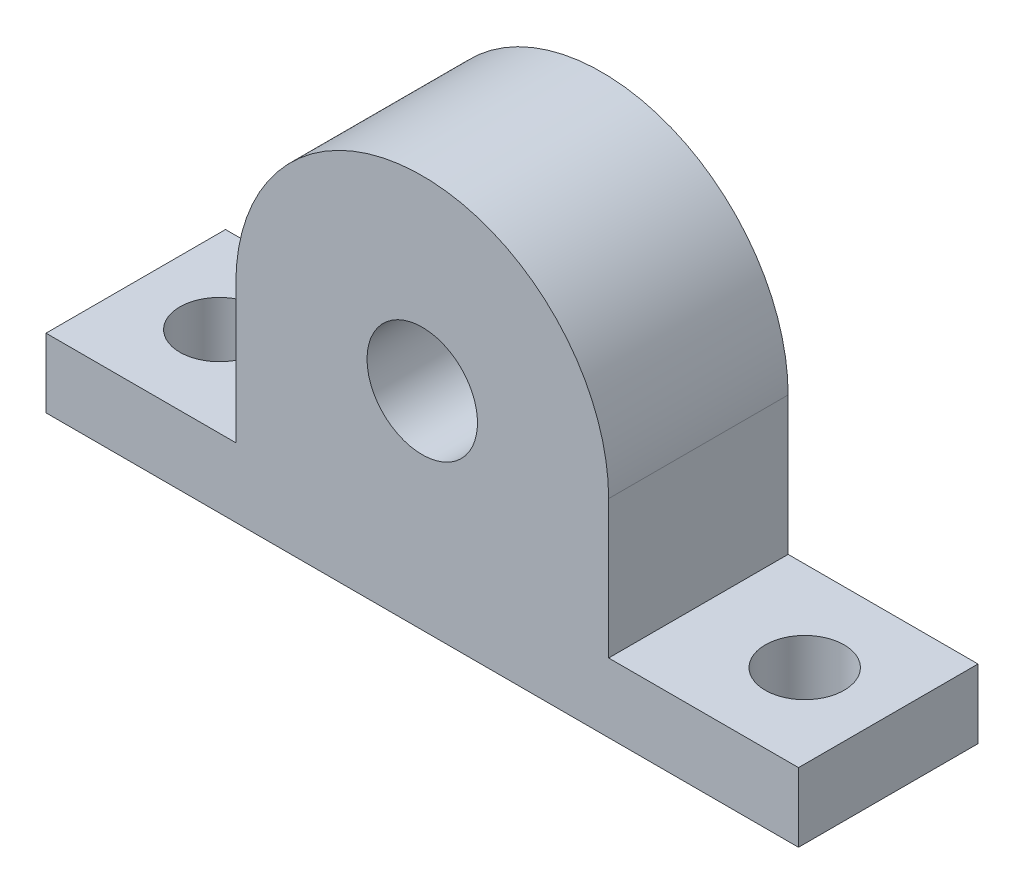
ISO-10303-21;
HEADER;
FILE_DESCRIPTION(('STEP AP214'),'2;1');
FILE_NAME('part.step','',(''),(''),'','','');
FILE_SCHEMA(('AUTOMOTIVE_DESIGN { 1 0 10303 214 1 1 1 1 }'));
ENDSEC;
DATA;
#1=APPLICATION_CONTEXT('core data for automotive mechanical design processes');
#2=APPLICATION_PROTOCOL_DEFINITION('international standard','automotive_design',2000,#1);
#3=PRODUCT_CONTEXT('',#1,'mechanical');
#4=PRODUCT('Part','Part','',(#3));
#5=PRODUCT_RELATED_PRODUCT_CATEGORY('part','',(#4));
#6=PRODUCT_DEFINITION_FORMATION('','',#4);
#7=PRODUCT_DEFINITION_CONTEXT('part definition',#1,'design');
#8=PRODUCT_DEFINITION('design','',#6,#7);
#9=PRODUCT_DEFINITION_SHAPE('','',#8);
#10=(LENGTH_UNIT() NAMED_UNIT(*) SI_UNIT(.MILLI.,.METRE.));
#11=(NAMED_UNIT(*) PLANE_ANGLE_UNIT() SI_UNIT($,.RADIAN.));
#12=(NAMED_UNIT(*) SI_UNIT($,.STERADIAN.) SOLID_ANGLE_UNIT());
#13=UNCERTAINTY_MEASURE_WITH_UNIT(LENGTH_MEASURE(1.E-05),#10,'distance_accuracy_value','');
#14=(GEOMETRIC_REPRESENTATION_CONTEXT(3) GLOBAL_UNCERTAINTY_ASSIGNED_CONTEXT((#13)) GLOBAL_UNIT_ASSIGNED_CONTEXT((#10,
#11,#12)) REPRESENTATION_CONTEXT('',''));
#15=CARTESIAN_POINT('',(0.,0.,0.));
#16=DIRECTION('',(0.,0.,1.));
#17=DIRECTION('',(1.,0.,0.));
#18=AXIS2_PLACEMENT_3D('',#15,#16,#17);
#19=CARTESIAN_POINT('',(27.25,15.,13.));
#20=DIRECTION('',(0.,0.,1.));
#21=DIRECTION('',(1.,0.,0.));
#22=AXIS2_PLACEMENT_3D('',#19,#20,#21);
#23=PLANE('',#22);
#24=DIRECTION('',(0.,-1.,0.));
#25=VECTOR('',#24,1.);
#26=CARTESIAN_POINT('',(0.,0.,13.));
#27=LINE('',#26,#25);
#28=CARTESIAN_POINT('',(0.,5.,13.));
#29=VERTEX_POINT('',#28);
#30=CARTESIAN_POINT('',(0.,0.,13.));
#31=VERTEX_POINT('',#30);
#32=EDGE_CURVE('E144',#29,#31,#27,.T.);
#33=ORIENTED_EDGE('',*,*,#32,.T.);
#34=DIRECTION('',(1.,0.,0.));
#35=VECTOR('',#34,1.);
#36=CARTESIAN_POINT('',(0.,0.,13.));
#37=LINE('',#36,#35);
#38=CARTESIAN_POINT('',(54.5,0.,13.));
#39=VERTEX_POINT('',#38);
#40=EDGE_CURVE('E92',#31,#39,#37,.T.);
#41=ORIENTED_EDGE('',*,*,#40,.T.);
#42=DIRECTION('',(0.,1.,0.));
#43=VECTOR('',#42,1.);
#44=CARTESIAN_POINT('',(54.5,0.,13.));
#45=LINE('',#44,#43);
#46=CARTESIAN_POINT('',(54.5,5.,13.));
#47=VERTEX_POINT('',#46);
#48=EDGE_CURVE('E159',#39,#47,#45,.T.);
#49=ORIENTED_EDGE('',*,*,#48,.T.);
#50=DIRECTION('',(-1.,0.,0.));
#51=VECTOR('',#50,1.);
#52=CARTESIAN_POINT('',(40.75,5.,13.));
#53=LINE('',#52,#51);
#54=CARTESIAN_POINT('',(40.75,5.,13.));
#55=VERTEX_POINT('',#54);
#56=EDGE_CURVE('E172',#47,#55,#53,.T.);
#57=ORIENTED_EDGE('',*,*,#56,.T.);
#58=DIRECTION('',(0.,1.,0.));
#59=VECTOR('',#58,1.);
#60=CARTESIAN_POINT('',(40.75,15.,13.));
#61=LINE('',#60,#59);
#62=CARTESIAN_POINT('',(40.75,15.,13.));
#63=VERTEX_POINT('',#62);
#64=EDGE_CURVE('E111',#55,#63,#61,.T.);
#65=ORIENTED_EDGE('',*,*,#64,.T.);
#66=CARTESIAN_POINT('',(27.25,15.,13.));
#67=DIRECTION('',(0.,0.,1.));
#68=DIRECTION('',(1.,0.,0.));
#69=AXIS2_PLACEMENT_3D('',#66,#67,#68);
#70=CIRCLE('',#69,13.5);
#71=CARTESIAN_POINT('',(13.75,15.,13.));
#72=VERTEX_POINT('',#71);
#73=EDGE_CURVE('E105',#63,#72,#70,.T.);
#74=ORIENTED_EDGE('',*,*,#73,.T.);
#75=DIRECTION('',(0.,-1.,0.));
#76=VECTOR('',#75,1.);
#77=CARTESIAN_POINT('',(13.75,15.,13.));
#78=LINE('',#77,#76);
#79=CARTESIAN_POINT('',(13.75,5.,13.));
#80=VERTEX_POINT('',#79);
#81=EDGE_CURVE('E109',#72,#80,#78,.T.);
#82=ORIENTED_EDGE('',*,*,#81,.T.);
#83=DIRECTION('',(-1.,0.,0.));
#84=VECTOR('',#83,1.);
#85=CARTESIAN_POINT('',(0.,5.,13.));
#86=LINE('',#85,#84);
#87=EDGE_CURVE('E49',#80,#29,#86,.T.);
#88=ORIENTED_EDGE('',*,*,#87,.T.);
#89=EDGE_LOOP('',(#33,#41,#49,#57,#65,#74,#82,#88));
#90=FACE_BOUND('',#89,.T.);
#91=CARTESIAN_POINT('',(27.25,15.,13.));
#92=DIRECTION('',(0.,0.,1.));
#93=DIRECTION('',(1.,0.,0.));
#94=AXIS2_PLACEMENT_3D('',#91,#92,#93);
#95=CIRCLE('',#94,4.);
#96=CARTESIAN_POINT('',(23.25,15.,13.));
#97=VERTEX_POINT('',#96);
#98=EDGE_CURVE('E133',#97,#97,#95,.T.);
#99=ORIENTED_EDGE('',*,*,#98,.F.);
#100=EDGE_LOOP('',(#99));
#101=FACE_BOUND('',#100,.T.);
#102=ADVANCED_FACE('F32',(#90,#101),#23,.T.);
#103=CARTESIAN_POINT('',(27.25,15.,0.));
#104=DIRECTION('',(0.,0.,1.));
#105=DIRECTION('',(1.,0.,0.));
#106=AXIS2_PLACEMENT_3D('',#103,#104,#105);
#107=PLANE('',#106);
#108=DIRECTION('',(0.,-1.,0.));
#109=VECTOR('',#108,1.);
#110=CARTESIAN_POINT('',(0.,0.,0.));
#111=LINE('',#110,#109);
#112=CARTESIAN_POINT('',(0.,5.,0.));
#113=VERTEX_POINT('',#112);
#114=CARTESIAN_POINT('',(0.,0.,0.));
#115=VERTEX_POINT('',#114);
#116=EDGE_CURVE('E129',#113,#115,#111,.T.);
#117=ORIENTED_EDGE('',*,*,#116,.F.);
#118=DIRECTION('',(-1.,0.,0.));
#119=VECTOR('',#118,1.);
#120=CARTESIAN_POINT('',(0.,5.,0.));
#121=LINE('',#120,#119);
#122=CARTESIAN_POINT('',(13.75,5.,0.));
#123=VERTEX_POINT('',#122);
#124=EDGE_CURVE('E84',#123,#113,#121,.T.);
#125=ORIENTED_EDGE('',*,*,#124,.F.);
#126=DIRECTION('',(0.,-1.,0.));
#127=VECTOR('',#126,1.);
#128=CARTESIAN_POINT('',(13.75,15.,0.));
#129=LINE('',#128,#127);
#130=CARTESIAN_POINT('',(13.75,15.,0.));
#131=VERTEX_POINT('',#130);
#132=EDGE_CURVE('E78',#131,#123,#129,.T.);
#133=ORIENTED_EDGE('',*,*,#132,.F.);
#134=CARTESIAN_POINT('',(27.25,15.,0.));
#135=DIRECTION('',(0.,0.,1.));
#136=DIRECTION('',(1.,0.,0.));
#137=AXIS2_PLACEMENT_3D('',#134,#135,#136);
#138=CIRCLE('',#137,13.5);
#139=CARTESIAN_POINT('',(40.75,15.,0.));
#140=VERTEX_POINT('',#139);
#141=EDGE_CURVE('E119',#140,#131,#138,.T.);
#142=ORIENTED_EDGE('',*,*,#141,.F.);
#143=DIRECTION('',(0.,1.,0.));
#144=VECTOR('',#143,1.);
#145=CARTESIAN_POINT('',(40.75,15.,0.));
#146=LINE('',#145,#144);
#147=CARTESIAN_POINT('',(40.75,5.,0.));
#148=VERTEX_POINT('',#147);
#149=EDGE_CURVE('E139',#148,#140,#146,.T.);
#150=ORIENTED_EDGE('',*,*,#149,.F.);
#151=DIRECTION('',(-1.,0.,0.));
#152=VECTOR('',#151,1.);
#153=CARTESIAN_POINT('',(40.75,5.,0.));
#154=LINE('',#153,#152);
#155=CARTESIAN_POINT('',(54.5,5.,0.));
#156=VERTEX_POINT('',#155);
#157=EDGE_CURVE('E137',#156,#148,#154,.T.);
#158=ORIENTED_EDGE('',*,*,#157,.F.);
#159=DIRECTION('',(0.,1.,0.));
#160=VECTOR('',#159,1.);
#161=CARTESIAN_POINT('',(54.5,0.,0.));
#162=LINE('',#161,#160);
#163=CARTESIAN_POINT('',(54.5,0.,0.));
#164=VERTEX_POINT('',#163);
#165=EDGE_CURVE('E135',#164,#156,#162,.T.);
#166=ORIENTED_EDGE('',*,*,#165,.F.);
#167=DIRECTION('',(1.,0.,0.));
#168=VECTOR('',#167,1.);
#169=CARTESIAN_POINT('',(0.,0.,0.));
#170=LINE('',#169,#168);
#171=EDGE_CURVE('E132',#115,#164,#170,.T.);
#172=ORIENTED_EDGE('',*,*,#171,.F.);
#173=EDGE_LOOP('',(#117,#125,#133,#142,#150,#158,#166,#172));
#174=FACE_BOUND('',#173,.T.);
#175=CARTESIAN_POINT('',(27.25,15.,0.));
#176=DIRECTION('',(0.,0.,1.));
#177=DIRECTION('',(1.,0.,0.));
#178=AXIS2_PLACEMENT_3D('',#175,#176,#177);
#179=CIRCLE('',#178,4.);
#180=CARTESIAN_POINT('',(23.25,15.,0.));
#181=VERTEX_POINT('',#180);
#182=EDGE_CURVE('E178',#181,#181,#179,.T.);
#183=ORIENTED_EDGE('',*,*,#182,.T.);
#184=EDGE_LOOP('',(#183));
#185=FACE_BOUND('',#184,.T.);
#186=ADVANCED_FACE('F163',(#174,#185),#107,.F.);
#187=CARTESIAN_POINT('',(0.,0.,13.));
#188=DIRECTION('',(1.,0.,0.));
#189=DIRECTION('',(0.,0.,-1.));
#190=AXIS2_PLACEMENT_3D('',#187,#188,#189);
#191=PLANE('',#190);
#192=ORIENTED_EDGE('',*,*,#116,.T.);
#193=DIRECTION('',(0.,0.,-1.));
#194=VECTOR('',#193,1.);
#195=CARTESIAN_POINT('',(0.,0.,13.));
#196=LINE('',#195,#194);
#197=EDGE_CURVE('E11',#31,#115,#196,.T.);
#198=ORIENTED_EDGE('',*,*,#197,.F.);
#199=ORIENTED_EDGE('',*,*,#32,.F.);
#200=DIRECTION('',(0.,0.,-1.));
#201=VECTOR('',#200,1.);
#202=CARTESIAN_POINT('',(0.,5.,13.));
#203=LINE('',#202,#201);
#204=EDGE_CURVE('E125',#29,#113,#203,.T.);
#205=ORIENTED_EDGE('',*,*,#204,.T.);
#206=EDGE_LOOP('',(#192,#198,#199,#205));
#207=FACE_BOUND('',#206,.T.);
#208=ADVANCED_FACE('F34',(#207),#191,.F.);
#209=CARTESIAN_POINT('',(0.,0.,13.));
#210=DIRECTION('',(0.,1.,0.));
#211=DIRECTION('',(0.,0.,1.));
#212=AXIS2_PLACEMENT_3D('',#209,#210,#211);
#213=PLANE('',#212);
#214=CARTESIAN_POINT('',(6.05,0.,6.49999999999999));
#215=DIRECTION('',(0.,1.,0.));
#216=DIRECTION('',(0.,0.,1.));
#217=AXIS2_PLACEMENT_3D('',#214,#215,#216);
#218=CIRCLE('',#217,2.85374590165543);
#219=CARTESIAN_POINT('',(3.19625409834457,0.,6.49999999999999));
#220=VERTEX_POINT('',#219);
#221=EDGE_CURVE('E189',#220,#220,#218,.T.);
#222=ORIENTED_EDGE('',*,*,#221,.T.);
#223=EDGE_LOOP('',(#222));
#224=FACE_BOUND('',#223,.T.);
#225=CARTESIAN_POINT('',(48.45,0.,6.5));
#226=DIRECTION('',(0.,1.,0.));
#227=DIRECTION('',(0.,0.,1.));
#228=AXIS2_PLACEMENT_3D('',#225,#226,#227);
#229=CIRCLE('',#228,2.85374590165543);
#230=CARTESIAN_POINT('',(45.5962540983446,0.,6.5));
#231=VERTEX_POINT('',#230);
#232=EDGE_CURVE('E181',#231,#231,#229,.T.);
#233=ORIENTED_EDGE('',*,*,#232,.T.);
#234=EDGE_LOOP('',(#233));
#235=FACE_BOUND('',#234,.T.);
#236=ORIENTED_EDGE('',*,*,#171,.T.);
#237=DIRECTION('',(0.,0.,-1.));
#238=VECTOR('',#237,1.);
#239=CARTESIAN_POINT('',(54.5,0.,13.));
#240=LINE('',#239,#238);
#241=EDGE_CURVE('E41',#39,#164,#240,.T.);
#242=ORIENTED_EDGE('',*,*,#241,.F.);
#243=ORIENTED_EDGE('',*,*,#40,.F.);
#244=ORIENTED_EDGE('',*,*,#197,.T.);
#245=EDGE_LOOP('',(#236,#242,#243,#244));
#246=FACE_BOUND('',#245,.T.);
#247=ADVANCED_FACE('F242',(#224,#235,#246),#213,.F.);
#248=CARTESIAN_POINT('',(54.5,0.,13.));
#249=DIRECTION('',(-1.,0.,0.));
#250=DIRECTION('',(0.,0.,1.));
#251=AXIS2_PLACEMENT_3D('',#248,#249,#250);
#252=PLANE('',#251);
#253=ORIENTED_EDGE('',*,*,#165,.T.);
#254=DIRECTION('',(0.,0.,-1.));
#255=VECTOR('',#254,1.);
#256=CARTESIAN_POINT('',(54.5,5.,13.));
#257=LINE('',#256,#255);
#258=EDGE_CURVE('E151',#47,#156,#257,.T.);
#259=ORIENTED_EDGE('',*,*,#258,.F.);
#260=ORIENTED_EDGE('',*,*,#48,.F.);
#261=ORIENTED_EDGE('',*,*,#241,.T.);
#262=EDGE_LOOP('',(#253,#259,#260,#261));
#263=FACE_BOUND('',#262,.T.);
#264=ADVANCED_FACE('F157',(#263),#252,.F.);
#265=CARTESIAN_POINT('',(40.75,5.,13.));
#266=DIRECTION('',(0.,-1.,0.));
#267=DIRECTION('',(1.,0.,0.));
#268=AXIS2_PLACEMENT_3D('',#265,#266,#267);
#269=PLANE('',#268);
#270=CARTESIAN_POINT('',(48.45,5.,6.5));
#271=DIRECTION('',(0.,1.,0.));
#272=DIRECTION('',(-1.,0.,0.));
#273=AXIS2_PLACEMENT_3D('',#270,#271,#272);
#274=CIRCLE('',#273,2.85374590165543);
#275=CARTESIAN_POINT('',(45.5962540983446,5.,6.5));
#276=VERTEX_POINT('',#275);
#277=EDGE_CURVE('E186',#276,#276,#274,.T.);
#278=ORIENTED_EDGE('',*,*,#277,.F.);
#279=EDGE_LOOP('',(#278));
#280=FACE_BOUND('',#279,.T.);
#281=ORIENTED_EDGE('',*,*,#157,.T.);
#282=DIRECTION('',(0.,0.,-1.));
#283=VECTOR('',#282,1.);
#284=CARTESIAN_POINT('',(40.75,5.,13.));
#285=LINE('',#284,#283);
#286=EDGE_CURVE('E148',#55,#148,#285,.T.);
#287=ORIENTED_EDGE('',*,*,#286,.F.);
#288=ORIENTED_EDGE('',*,*,#56,.F.);
#289=ORIENTED_EDGE('',*,*,#258,.T.);
#290=EDGE_LOOP('',(#281,#287,#288,#289));
#291=FACE_BOUND('',#290,.T.);
#292=ADVANCED_FACE('F168',(#280,#291),#269,.F.);
#293=CARTESIAN_POINT('',(40.75,15.,13.));
#294=DIRECTION('',(-1.,0.,0.));
#295=DIRECTION('',(0.,0.,1.));
#296=AXIS2_PLACEMENT_3D('',#293,#294,#295);
#297=PLANE('',#296);
#298=ORIENTED_EDGE('',*,*,#149,.T.);
#299=DIRECTION('',(0.,0.,-1.));
#300=VECTOR('',#299,1.);
#301=CARTESIAN_POINT('',(40.75,15.,13.));
#302=LINE('',#301,#300);
#303=EDGE_CURVE('E120',#63,#140,#302,.T.);
#304=ORIENTED_EDGE('',*,*,#303,.F.);
#305=ORIENTED_EDGE('',*,*,#64,.F.);
#306=ORIENTED_EDGE('',*,*,#286,.T.);
#307=EDGE_LOOP('',(#298,#304,#305,#306));
#308=FACE_BOUND('',#307,.T.);
#309=ADVANCED_FACE('F171',(#308),#297,.F.);
#310=CARTESIAN_POINT('',(27.25,15.,13.));
#311=DIRECTION('',(0.,0.,-1.));
#312=DIRECTION('',(-1.,0.,0.));
#313=AXIS2_PLACEMENT_3D('',#310,#311,#312);
#314=CYLINDRICAL_SURFACE('',#313,13.5);
#315=ORIENTED_EDGE('',*,*,#141,.T.);
#316=DIRECTION('',(0.,0.,-1.));
#317=VECTOR('',#316,1.);
#318=CARTESIAN_POINT('',(13.75,15.,13.));
#319=LINE('',#318,#317);
#320=EDGE_CURVE('E116',#72,#131,#319,.T.);
#321=ORIENTED_EDGE('',*,*,#320,.F.);
#322=ORIENTED_EDGE('',*,*,#73,.F.);
#323=ORIENTED_EDGE('',*,*,#303,.T.);
#324=EDGE_LOOP('',(#315,#321,#322,#323));
#325=FACE_BOUND('',#324,.T.);
#326=ADVANCED_FACE('F117',(#325),#314,.T.);
#327=CARTESIAN_POINT('',(13.75,15.,13.));
#328=DIRECTION('',(1.,0.,0.));
#329=DIRECTION('',(0.,0.,-1.));
#330=AXIS2_PLACEMENT_3D('',#327,#328,#329);
#331=PLANE('',#330);
#332=ORIENTED_EDGE('',*,*,#132,.T.);
#333=DIRECTION('',(0.,0.,-1.));
#334=VECTOR('',#333,1.);
#335=CARTESIAN_POINT('',(13.75,5.,13.));
#336=LINE('',#335,#334);
#337=EDGE_CURVE('E121',#80,#123,#336,.T.);
#338=ORIENTED_EDGE('',*,*,#337,.F.);
#339=ORIENTED_EDGE('',*,*,#81,.F.);
#340=ORIENTED_EDGE('',*,*,#320,.T.);
#341=EDGE_LOOP('',(#332,#338,#339,#340));
#342=FACE_BOUND('',#341,.T.);
#343=ADVANCED_FACE('F123',(#342),#331,.F.);
#344=CARTESIAN_POINT('',(0.,5.,13.));
#345=DIRECTION('',(0.,-1.,0.));
#346=DIRECTION('',(1.,0.,0.));
#347=AXIS2_PLACEMENT_3D('',#344,#345,#346);
#348=PLANE('',#347);
#349=CARTESIAN_POINT('',(6.05,5.,6.49999999999999));
#350=DIRECTION('',(0.,1.,0.));
#351=DIRECTION('',(1.,0.,0.));
#352=AXIS2_PLACEMENT_3D('',#349,#350,#351);
#353=CIRCLE('',#352,2.85374590165543);
#354=CARTESIAN_POINT('',(3.19625409834457,5.,6.49999999999999));
#355=VERTEX_POINT('',#354);
#356=EDGE_CURVE('E192',#355,#355,#353,.T.);
#357=ORIENTED_EDGE('',*,*,#356,.F.);
#358=EDGE_LOOP('',(#357));
#359=FACE_BOUND('',#358,.T.);
#360=ORIENTED_EDGE('',*,*,#124,.T.);
#361=ORIENTED_EDGE('',*,*,#204,.F.);
#362=ORIENTED_EDGE('',*,*,#87,.F.);
#363=ORIENTED_EDGE('',*,*,#337,.T.);
#364=EDGE_LOOP('',(#360,#361,#362,#363));
#365=FACE_BOUND('',#364,.T.);
#366=ADVANCED_FACE('F199',(#359,#365),#348,.F.);
#367=CARTESIAN_POINT('',(27.25,15.,13.));
#368=DIRECTION('',(0.,0.,-1.));
#369=DIRECTION('',(-1.,0.,0.));
#370=AXIS2_PLACEMENT_3D('',#367,#368,#369);
#371=CYLINDRICAL_SURFACE('',#370,4.);
#372=CARTESIAN_POINT('',(23.25,15.,13.));
#373=CARTESIAN_POINT('',(23.25,15.,12.8645833333333));
#374=CARTESIAN_POINT('',(23.25,15.,12.7291666666667));
#375=CARTESIAN_POINT('',(23.25,15.,12.4583333333333));
#376=CARTESIAN_POINT('',(23.25,15.,12.3229166666667));
#377=CARTESIAN_POINT('',(23.25,15.,12.0520833333333));
#378=CARTESIAN_POINT('',(23.25,15.,11.9166666666667));
#379=CARTESIAN_POINT('',(23.25,15.,11.6458333333333));
#380=CARTESIAN_POINT('',(23.25,15.,11.5104166666667));
#381=CARTESIAN_POINT('',(23.25,15.,11.2395833333333));
#382=CARTESIAN_POINT('',(23.25,15.,11.1041666666667));
#383=CARTESIAN_POINT('',(23.25,15.,10.8333333333333));
#384=CARTESIAN_POINT('',(23.25,15.,10.6979166666667));
#385=CARTESIAN_POINT('',(23.25,15.,10.4270833333333));
#386=CARTESIAN_POINT('',(23.25,15.,10.2916666666667));
#387=CARTESIAN_POINT('',(23.25,15.,10.0208333333333));
#388=CARTESIAN_POINT('',(23.25,15.,9.88541666666667));
#389=CARTESIAN_POINT('',(23.25,15.,9.61458333333333));
#390=CARTESIAN_POINT('',(23.25,15.,9.47916666666667));
#391=CARTESIAN_POINT('',(23.25,15.,9.20833333333333));
#392=CARTESIAN_POINT('',(23.25,15.,9.07291666666667));
#393=CARTESIAN_POINT('',(23.25,15.,8.80208333333333));
#394=CARTESIAN_POINT('',(23.25,15.,8.66666666666667));
#395=CARTESIAN_POINT('',(23.25,15.,8.39583333333333));
#396=CARTESIAN_POINT('',(23.25,15.,8.26041666666667));
#397=CARTESIAN_POINT('',(23.25,15.,7.98958333333333));
#398=CARTESIAN_POINT('',(23.25,15.,7.85416666666667));
#399=CARTESIAN_POINT('',(23.25,15.,7.58333333333333));
#400=CARTESIAN_POINT('',(23.25,15.,7.44791666666667));
#401=CARTESIAN_POINT('',(23.25,15.,7.17708333333333));
#402=CARTESIAN_POINT('',(23.25,15.,7.04166666666667));
#403=CARTESIAN_POINT('',(23.25,15.,6.77083333333333));
#404=CARTESIAN_POINT('',(23.25,15.,6.63541666666667));
#405=CARTESIAN_POINT('',(23.25,15.,6.36458333333333));
#406=CARTESIAN_POINT('',(23.25,15.,6.22916666666667));
#407=CARTESIAN_POINT('',(23.25,15.,5.95833333333333));
#408=CARTESIAN_POINT('',(23.25,15.,5.82291666666667));
#409=CARTESIAN_POINT('',(23.25,15.,5.55208333333333));
#410=CARTESIAN_POINT('',(23.25,15.,5.41666666666667));
#411=CARTESIAN_POINT('',(23.25,15.,5.14583333333333));
#412=CARTESIAN_POINT('',(23.25,15.,5.01041666666667));
#413=CARTESIAN_POINT('',(23.25,15.,4.73958333333333));
#414=CARTESIAN_POINT('',(23.25,15.,4.60416666666667));
#415=CARTESIAN_POINT('',(23.25,15.,4.33333333333333));
#416=CARTESIAN_POINT('',(23.25,15.,4.19791666666667));
#417=CARTESIAN_POINT('',(23.25,15.,3.92708333333333));
#418=CARTESIAN_POINT('',(23.25,15.,3.79166666666667));
#419=CARTESIAN_POINT('',(23.25,15.,3.52083333333333));
#420=CARTESIAN_POINT('',(23.25,15.,3.38541666666667));
#421=CARTESIAN_POINT('',(23.25,15.,3.11458333333333));
#422=CARTESIAN_POINT('',(23.25,15.,2.97916666666667));
#423=CARTESIAN_POINT('',(23.25,15.,2.70833333333333));
#424=CARTESIAN_POINT('',(23.25,15.,2.57291666666667));
#425=CARTESIAN_POINT('',(23.25,15.,2.30208333333333));
#426=CARTESIAN_POINT('',(23.25,15.,2.16666666666667));
#427=CARTESIAN_POINT('',(23.25,15.,1.89583333333333));
#428=CARTESIAN_POINT('',(23.25,15.,1.76041666666667));
#429=CARTESIAN_POINT('',(23.25,15.,1.48958333333333));
#430=CARTESIAN_POINT('',(23.25,15.,1.35416666666667));
#431=CARTESIAN_POINT('',(23.25,15.,1.08333333333333));
#432=CARTESIAN_POINT('',(23.25,15.,0.947916666666667));
#433=CARTESIAN_POINT('',(23.25,15.,0.677083333333334));
#434=CARTESIAN_POINT('',(23.25,15.,0.541666666666667));
#435=CARTESIAN_POINT('',(23.25,15.,0.270833333333334));
#436=CARTESIAN_POINT('',(23.25,15.,0.135416666666667));
#437=CARTESIAN_POINT('',(23.25,15.,0.));
#438=B_SPLINE_CURVE_WITH_KNOTS('',3,(#372,#373,#374,#375,#376,#377,#378,#379,#380,#381,#382,
#383,#384,#385,#386,#387,#388,#389,#390,#391,#392,#393,#394,#395,#396,#397,#398,#399,#400,#401,
#402,#403,#404,#405,#406,#407,#408,#409,#410,#411,#412,#413,#414,#415,#416,#417,#418,#419,#420,
#421,#422,#423,#424,#425,#426,#427,#428,#429,#430,#431,#432,#433,#434,#435,#436,#437),
.UNSPECIFIED.,.F.,.F.,(4,2,2,2,2,2,2,2,2,2,2,2,2,2,2,2,2,2,2,2,2,2,2,2,2,2,2,2,2,2,2,2,4),(0.,
0.406249999999999,0.812499999999999,1.21875,1.625,2.03125,2.4375,2.84375,3.25,3.65625,4.0625,
4.46875,4.875,5.28125,5.6875,6.09375,6.5,6.90625,7.3125,7.71875,8.125,8.53125,8.9375,9.34375,
9.75,10.15625,10.5625,10.96875,11.375,11.78125,12.1875,12.59375,13.),.UNSPECIFIED.);
#439=EDGE_CURVE('BSEAM201',#97,#181,#438,.T.);
#440=ORIENTED_EDGE('',*,*,#98,.T.);
#441=ORIENTED_EDGE('',*,*,#182,.F.);
#442=ORIENTED_EDGE('',*,*,#439,.T.);
#443=ORIENTED_EDGE('',*,*,#439,.F.);
#444=EDGE_LOOP('',(#440,#442,#441,#443));
#445=FACE_BOUND('',#444,.T.);
#446=ADVANCED_FACE('F201',(#445),#371,.F.);
#447=CARTESIAN_POINT('',(48.45,-8.,6.5));
#448=DIRECTION('',(0.,1.,0.));
#449=DIRECTION('',(-1.,0.,0.));
#450=AXIS2_PLACEMENT_3D('',#447,#448,#449);
#451=CYLINDRICAL_SURFACE('',#450,2.85374590165543);
#452=CARTESIAN_POINT('',(45.5962540983446,5.,6.5));
#453=CARTESIAN_POINT('',(45.5962540983446,4.94791666666667,6.5));
#454=CARTESIAN_POINT('',(45.5962540983446,4.89583333333334,6.5));
#455=CARTESIAN_POINT('',(45.5962540983446,4.79166666666667,6.5));
#456=CARTESIAN_POINT('',(45.5962540983446,4.73958333333334,6.5));
#457=CARTESIAN_POINT('',(45.5962540983446,4.63541666666667,6.5));
#458=CARTESIAN_POINT('',(45.5962540983446,4.58333333333334,6.5));
#459=CARTESIAN_POINT('',(45.5962540983446,4.47916666666667,6.5));
#460=CARTESIAN_POINT('',(45.5962540983446,4.42708333333334,6.5));
#461=CARTESIAN_POINT('',(45.5962540983446,4.32291666666667,6.5));
#462=CARTESIAN_POINT('',(45.5962540983446,4.27083333333334,6.5));
#463=CARTESIAN_POINT('',(45.5962540983446,4.16666666666667,6.5));
#464=CARTESIAN_POINT('',(45.5962540983446,4.11458333333334,6.5));
#465=CARTESIAN_POINT('',(45.5962540983446,4.01041666666667,6.5));
#466=CARTESIAN_POINT('',(45.5962540983446,3.95833333333334,6.5));
#467=CARTESIAN_POINT('',(45.5962540983446,3.85416666666667,6.5));
#468=CARTESIAN_POINT('',(45.5962540983446,3.80208333333333,6.5));
#469=CARTESIAN_POINT('',(45.5962540983446,3.69791666666667,6.5));
#470=CARTESIAN_POINT('',(45.5962540983446,3.64583333333333,6.5));
#471=CARTESIAN_POINT('',(45.5962540983446,3.54166666666667,6.5));
#472=CARTESIAN_POINT('',(45.5962540983446,3.48958333333333,6.5));
#473=CARTESIAN_POINT('',(45.5962540983446,3.38541666666667,6.5));
#474=CARTESIAN_POINT('',(45.5962540983446,3.33333333333333,6.5));
#475=CARTESIAN_POINT('',(45.5962540983446,3.22916666666667,6.5));
#476=CARTESIAN_POINT('',(45.5962540983446,3.17708333333333,6.5));
#477=CARTESIAN_POINT('',(45.5962540983446,3.07291666666667,6.5));
#478=CARTESIAN_POINT('',(45.5962540983446,3.02083333333333,6.5));
#479=CARTESIAN_POINT('',(45.5962540983446,2.91666666666667,6.5));
#480=CARTESIAN_POINT('',(45.5962540983446,2.86458333333333,6.5));
#481=CARTESIAN_POINT('',(45.5962540983446,2.76041666666667,6.5));
#482=CARTESIAN_POINT('',(45.5962540983446,2.70833333333333,6.5));
#483=CARTESIAN_POINT('',(45.5962540983446,2.60416666666667,6.5));
#484=CARTESIAN_POINT('',(45.5962540983446,2.55208333333333,6.5));
#485=CARTESIAN_POINT('',(45.5962540983446,2.44791666666667,6.5));
#486=CARTESIAN_POINT('',(45.5962540983446,2.39583333333333,6.5));
#487=CARTESIAN_POINT('',(45.5962540983446,2.29166666666667,6.5));
#488=CARTESIAN_POINT('',(45.5962540983446,2.23958333333333,6.5));
#489=CARTESIAN_POINT('',(45.5962540983446,2.13541666666667,6.5));
#490=CARTESIAN_POINT('',(45.5962540983446,2.08333333333333,6.5));
#491=CARTESIAN_POINT('',(45.5962540983446,1.97916666666667,6.5));
#492=CARTESIAN_POINT('',(45.5962540983446,1.92708333333333,6.5));
#493=CARTESIAN_POINT('',(45.5962540983446,1.82291666666667,6.5));
#494=CARTESIAN_POINT('',(45.5962540983446,1.77083333333333,6.5));
#495=CARTESIAN_POINT('',(45.5962540983446,1.66666666666667,6.5));
#496=CARTESIAN_POINT('',(45.5962540983446,1.61458333333333,6.5));
#497=CARTESIAN_POINT('',(45.5962540983446,1.51041666666667,6.5));
#498=CARTESIAN_POINT('',(45.5962540983446,1.45833333333333,6.5));
#499=CARTESIAN_POINT('',(45.5962540983446,1.35416666666667,6.5));
#500=CARTESIAN_POINT('',(45.5962540983446,1.30208333333333,6.5));
#501=CARTESIAN_POINT('',(45.5962540983446,1.19791666666667,6.5));
#502=CARTESIAN_POINT('',(45.5962540983446,1.14583333333333,6.5));
#503=CARTESIAN_POINT('',(45.5962540983446,1.04166666666667,6.5));
#504=CARTESIAN_POINT('',(45.5962540983446,0.989583333333333,6.5));
#505=CARTESIAN_POINT('',(45.5962540983446,0.885416666666666,6.5));
#506=CARTESIAN_POINT('',(45.5962540983446,0.833333333333332,6.5));
#507=CARTESIAN_POINT('',(45.5962540983446,0.729166666666666,6.5));
#508=CARTESIAN_POINT('',(45.5962540983446,0.677083333333332,6.5));
#509=CARTESIAN_POINT('',(45.5962540983446,0.572916666666666,6.5));
#510=CARTESIAN_POINT('',(45.5962540983446,0.520833333333332,6.5));
#511=CARTESIAN_POINT('',(45.5962540983446,0.416666666666665,6.5));
#512=CARTESIAN_POINT('',(45.5962540983446,0.364583333333332,6.5));
#513=CARTESIAN_POINT('',(45.5962540983446,0.260416666666665,6.5));
#514=CARTESIAN_POINT('',(45.5962540983446,0.208333333333332,6.5));
#515=CARTESIAN_POINT('',(45.5962540983446,0.104166666666665,6.5));
#516=CARTESIAN_POINT('',(45.5962540983446,0.0520833333333317,6.5));
#517=CARTESIAN_POINT('',(45.5962540983446,0.,6.5));
#518=B_SPLINE_CURVE_WITH_KNOTS('',3,(#452,#453,#454,#455,#456,#457,#458,#459,#460,#461,#462,
#463,#464,#465,#466,#467,#468,#469,#470,#471,#472,#473,#474,#475,#476,#477,#478,#479,#480,#481,
#482,#483,#484,#485,#486,#487,#488,#489,#490,#491,#492,#493,#494,#495,#496,#497,#498,#499,#500,
#501,#502,#503,#504,#505,#506,#507,#508,#509,#510,#511,#512,#513,#514,#515,#516,#517),
.UNSPECIFIED.,.F.,.F.,(4,2,2,2,2,2,2,2,2,2,2,2,2,2,2,2,2,2,2,2,2,2,2,2,2,2,2,2,2,2,2,2,4),(0.,
0.15625,0.3125,0.46875,0.625000000000001,0.781250000000001,0.937500000000001,1.09375,1.25,
1.40625,1.5625,1.71875,1.875,2.03125,2.1875,2.34375,2.5,2.65625,2.8125,2.96875,3.125,3.28125,
3.4375,3.59375,3.75,3.90625,4.0625,4.21875,4.375,4.53125,4.6875,4.84375,5.),.UNSPECIFIED.);
#519=EDGE_CURVE('BSEAM207',#276,#231,#518,.T.);
#520=ORIENTED_EDGE('',*,*,#277,.T.);
#521=ORIENTED_EDGE('',*,*,#232,.F.);
#522=ORIENTED_EDGE('',*,*,#519,.T.);
#523=ORIENTED_EDGE('',*,*,#519,.F.);
#524=EDGE_LOOP('',(#520,#522,#521,#523));
#525=FACE_BOUND('',#524,.T.);
#526=ADVANCED_FACE('F207',(#525),#451,.F.);
#527=CARTESIAN_POINT('',(6.05,-8.,6.49999999999999));
#528=DIRECTION('',(0.,1.,0.));
#529=DIRECTION('',(-1.,0.,0.));
#530=AXIS2_PLACEMENT_3D('',#527,#528,#529);
#531=CYLINDRICAL_SURFACE('',#530,2.85374590165543);
#532=CARTESIAN_POINT('',(3.19625409834457,5.,6.49999999999999));
#533=CARTESIAN_POINT('',(3.19625409834457,4.94791666666667,6.49999999999999));
#534=CARTESIAN_POINT('',(3.19625409834457,4.89583333333333,6.49999999999999));
#535=CARTESIAN_POINT('',(3.19625409834457,4.79166666666667,6.49999999999999));
#536=CARTESIAN_POINT('',(3.19625409834457,4.73958333333333,6.49999999999999));
#537=CARTESIAN_POINT('',(3.19625409834457,4.63541666666667,6.49999999999999));
#538=CARTESIAN_POINT('',(3.19625409834457,4.58333333333333,6.49999999999999));
#539=CARTESIAN_POINT('',(3.19625409834457,4.47916666666667,6.49999999999999));
#540=CARTESIAN_POINT('',(3.19625409834457,4.42708333333333,6.49999999999999));
#541=CARTESIAN_POINT('',(3.19625409834457,4.32291666666667,6.49999999999999));
#542=CARTESIAN_POINT('',(3.19625409834457,4.27083333333333,6.49999999999999));
#543=CARTESIAN_POINT('',(3.19625409834457,4.16666666666667,6.49999999999999));
#544=CARTESIAN_POINT('',(3.19625409834457,4.11458333333333,6.49999999999999));
#545=CARTESIAN_POINT('',(3.19625409834457,4.01041666666666,6.49999999999999));
#546=CARTESIAN_POINT('',(3.19625409834457,3.95833333333333,6.49999999999999));
#547=CARTESIAN_POINT('',(3.19625409834457,3.85416666666667,6.49999999999999));
#548=CARTESIAN_POINT('',(3.19625409834457,3.80208333333333,6.49999999999999));
#549=CARTESIAN_POINT('',(3.19625409834457,3.69791666666666,6.49999999999999));
#550=CARTESIAN_POINT('',(3.19625409834457,3.64583333333333,6.49999999999999));
#551=CARTESIAN_POINT('',(3.19625409834457,3.54166666666667,6.49999999999999));
#552=CARTESIAN_POINT('',(3.19625409834457,3.48958333333333,6.49999999999999));
#553=CARTESIAN_POINT('',(3.19625409834457,3.38541666666667,6.49999999999999));
#554=CARTESIAN_POINT('',(3.19625409834457,3.33333333333333,6.49999999999999));
#555=CARTESIAN_POINT('',(3.19625409834457,3.22916666666667,6.49999999999999));
#556=CARTESIAN_POINT('',(3.19625409834457,3.17708333333333,6.49999999999999));
#557=CARTESIAN_POINT('',(3.19625409834457,3.07291666666667,6.49999999999999));
#558=CARTESIAN_POINT('',(3.19625409834457,3.02083333333333,6.49999999999999));
#559=CARTESIAN_POINT('',(3.19625409834457,2.91666666666667,6.49999999999999));
#560=CARTESIAN_POINT('',(3.19625409834457,2.86458333333333,6.49999999999999));
#561=CARTESIAN_POINT('',(3.19625409834457,2.76041666666667,6.49999999999999));
#562=CARTESIAN_POINT('',(3.19625409834457,2.70833333333333,6.49999999999999));
#563=CARTESIAN_POINT('',(3.19625409834457,2.60416666666667,6.49999999999999));
#564=CARTESIAN_POINT('',(3.19625409834457,2.55208333333333,6.49999999999999));
#565=CARTESIAN_POINT('',(3.19625409834457,2.44791666666667,6.49999999999999));
#566=CARTESIAN_POINT('',(3.19625409834457,2.39583333333333,6.49999999999999));
#567=CARTESIAN_POINT('',(3.19625409834457,2.29166666666667,6.49999999999999));
#568=CARTESIAN_POINT('',(3.19625409834457,2.23958333333333,6.49999999999999));
#569=CARTESIAN_POINT('',(3.19625409834457,2.13541666666667,6.49999999999999));
#570=CARTESIAN_POINT('',(3.19625409834457,2.08333333333333,6.49999999999999));
#571=CARTESIAN_POINT('',(3.19625409834457,1.97916666666667,6.49999999999999));
#572=CARTESIAN_POINT('',(3.19625409834457,1.92708333333333,6.49999999999999));
#573=CARTESIAN_POINT('',(3.19625409834457,1.82291666666666,6.49999999999999));
#574=CARTESIAN_POINT('',(3.19625409834457,1.77083333333333,6.49999999999999));
#575=CARTESIAN_POINT('',(3.19625409834457,1.66666666666667,6.49999999999999));
#576=CARTESIAN_POINT('',(3.19625409834457,1.61458333333333,6.49999999999999));
#577=CARTESIAN_POINT('',(3.19625409834457,1.51041666666667,6.49999999999999));
#578=CARTESIAN_POINT('',(3.19625409834457,1.45833333333333,6.49999999999999));
#579=CARTESIAN_POINT('',(3.19625409834457,1.35416666666667,6.49999999999999));
#580=CARTESIAN_POINT('',(3.19625409834457,1.30208333333333,6.49999999999999));
#581=CARTESIAN_POINT('',(3.19625409834457,1.19791666666667,6.49999999999999));
#582=CARTESIAN_POINT('',(3.19625409834457,1.14583333333333,6.49999999999999));
#583=CARTESIAN_POINT('',(3.19625409834457,1.04166666666667,6.49999999999999));
#584=CARTESIAN_POINT('',(3.19625409834457,0.989583333333333,6.49999999999999));
#585=CARTESIAN_POINT('',(3.19625409834457,0.885416666666666,6.49999999999999));
#586=CARTESIAN_POINT('',(3.19625409834457,0.833333333333332,6.49999999999999));
#587=CARTESIAN_POINT('',(3.19625409834457,0.729166666666666,6.49999999999999));
#588=CARTESIAN_POINT('',(3.19625409834457,0.677083333333332,6.49999999999999));
#589=CARTESIAN_POINT('',(3.19625409834457,0.572916666666666,6.49999999999999));
#590=CARTESIAN_POINT('',(3.19625409834457,0.520833333333332,6.49999999999999));
#591=CARTESIAN_POINT('',(3.19625409834457,0.416666666666665,6.49999999999999));
#592=CARTESIAN_POINT('',(3.19625409834457,0.364583333333332,6.49999999999999));
#593=CARTESIAN_POINT('',(3.19625409834457,0.260416666666665,6.49999999999999));
#594=CARTESIAN_POINT('',(3.19625409834457,0.208333333333332,6.49999999999999));
#595=CARTESIAN_POINT('',(3.19625409834457,0.104166666666665,6.49999999999999));
#596=CARTESIAN_POINT('',(3.19625409834457,0.0520833333333317,6.49999999999999));
#597=CARTESIAN_POINT('',(3.19625409834457,0.,6.49999999999999));
#598=B_SPLINE_CURVE_WITH_KNOTS('',3,(#532,#533,#534,#535,#536,#537,#538,#539,#540,#541,#542,
#543,#544,#545,#546,#547,#548,#549,#550,#551,#552,#553,#554,#555,#556,#557,#558,#559,#560,#561,
#562,#563,#564,#565,#566,#567,#568,#569,#570,#571,#572,#573,#574,#575,#576,#577,#578,#579,#580,
#581,#582,#583,#584,#585,#586,#587,#588,#589,#590,#591,#592,#593,#594,#595,#596,#597),
.UNSPECIFIED.,.F.,.F.,(4,2,2,2,2,2,2,2,2,2,2,2,2,2,2,2,2,2,2,2,2,2,2,2,2,2,2,2,2,2,2,2,4),(0.,
0.15625,0.3125,0.46875,0.625000000000001,0.781250000000001,0.937500000000001,1.09375,1.25,
1.40625,1.5625,1.71875,1.875,2.03125,2.1875,2.34375,2.5,2.65625,2.8125,2.96875,3.125,3.28125,
3.4375,3.59375,3.75,3.90625,4.0625,4.21875,4.375,4.53125,4.6875,4.84375,5.),.UNSPECIFIED.);
#599=EDGE_CURVE('BSEAM196',#355,#220,#598,.T.);
#600=ORIENTED_EDGE('',*,*,#356,.T.);
#601=ORIENTED_EDGE('',*,*,#221,.F.);
#602=ORIENTED_EDGE('',*,*,#599,.T.);
#603=ORIENTED_EDGE('',*,*,#599,.F.);
#604=EDGE_LOOP('',(#600,#602,#601,#603));
#605=FACE_BOUND('',#604,.T.);
#606=ADVANCED_FACE('F196',(#605),#531,.F.);
#607=CLOSED_SHELL('',(#102,#186,#208,#247,#264,#292,#309,#326,#343,#366,#446,#526,#606));
#608=MANIFOLD_SOLID_BREP('B2',#607);
#609=ADVANCED_BREP_SHAPE_REPRESENTATION('',(#18,#608),#14);
#610=SHAPE_DEFINITION_REPRESENTATION(#9,#609);
ENDSEC;
END-ISO-10303-21;
